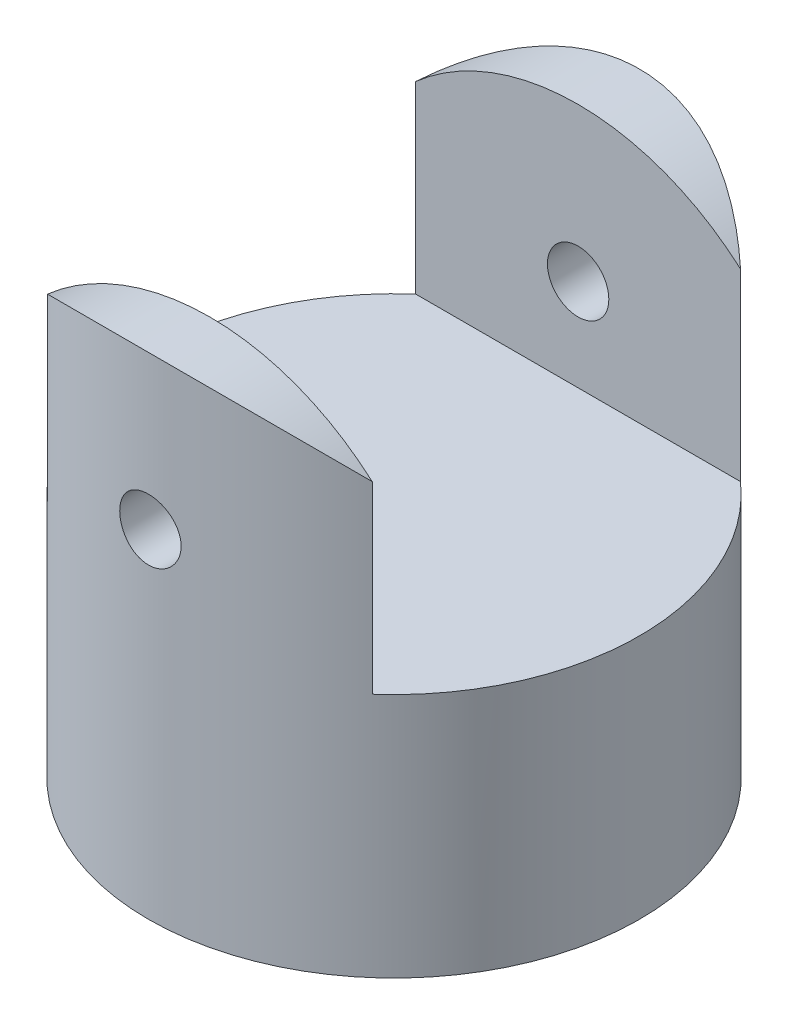
ISO-10303-21;
HEADER;
FILE_DESCRIPTION(('STEP AP214'),'2;1');
FILE_NAME('part.step','',(''),(''),'','','');
FILE_SCHEMA(('AUTOMOTIVE_DESIGN { 1 0 10303 214 1 1 1 1 }'));
ENDSEC;
DATA;
#1=APPLICATION_CONTEXT('core data for automotive mechanical design processes');
#2=APPLICATION_PROTOCOL_DEFINITION('international standard','automotive_design',2000,#1);
#3=PRODUCT_CONTEXT('',#1,'mechanical');
#4=PRODUCT('Part','Part','',(#3));
#5=PRODUCT_RELATED_PRODUCT_CATEGORY('part','',(#4));
#6=PRODUCT_DEFINITION_FORMATION('','',#4);
#7=PRODUCT_DEFINITION_CONTEXT('part definition',#1,'design');
#8=PRODUCT_DEFINITION('design','',#6,#7);
#9=PRODUCT_DEFINITION_SHAPE('','',#8);
#10=(LENGTH_UNIT() NAMED_UNIT(*) SI_UNIT(.MILLI.,.METRE.));
#11=(NAMED_UNIT(*) PLANE_ANGLE_UNIT() SI_UNIT($,.RADIAN.));
#12=(NAMED_UNIT(*) SI_UNIT($,.STERADIAN.) SOLID_ANGLE_UNIT());
#13=UNCERTAINTY_MEASURE_WITH_UNIT(LENGTH_MEASURE(1.E-05),#10,'distance_accuracy_value','');
#14=(GEOMETRIC_REPRESENTATION_CONTEXT(3) GLOBAL_UNCERTAINTY_ASSIGNED_CONTEXT((#13)) GLOBAL_UNIT_ASSIGNED_CONTEXT((#10,
#11,#12)) REPRESENTATION_CONTEXT('',''));
#15=CARTESIAN_POINT('',(0.,0.,0.));
#16=DIRECTION('',(0.,0.,1.));
#17=DIRECTION('',(1.,0.,0.));
#18=AXIS2_PLACEMENT_3D('',#15,#16,#17);
#19=CARTESIAN_POINT('',(0.,101.6,0.));
#20=DIRECTION('',(0.,-1.,0.));
#21=DIRECTION('',(0.,0.,-1.));
#22=AXIS2_PLACEMENT_3D('',#19,#20,#21);
#23=CYLINDRICAL_SURFACE('',#22,50.8);
#24=CARTESIAN_POINT('',(0.,0.,0.));
#25=DIRECTION('',(0.,1.,0.));
#26=DIRECTION('',(0.,0.,1.));
#27=AXIS2_PLACEMENT_3D('',#24,#25,#26);
#28=CIRCLE('',#27,50.8);
#29=CARTESIAN_POINT('',(0.,0.,50.8));
#30=VERTEX_POINT('',#29);
#31=EDGE_CURVE('E11',#30,#30,#28,.T.);
#32=ORIENTED_EDGE('',*,*,#31,.T.);
#33=EDGE_LOOP('',(#32));
#34=FACE_BOUND('',#33,.T.);
#35=CARTESIAN_POINT('',(-6.35,69.85,50.4015624757805));
#36=CARTESIAN_POINT('',(-6.35000203989487,69.6723456462251,50.4015617724459));
#37=CARTESIAN_POINT('',(-6.34254196397741,69.4947212229358,50.4025036623052));
#38=CARTESIAN_POINT('',(-6.312759005209,69.1406861903938,50.4062427706675));
#39=CARTESIAN_POINT('',(-6.2904327526822,68.9642758654991,50.4090404098076));
#40=CARTESIAN_POINT('',(-6.23105610404001,68.6138577778681,50.4164142968493));
#41=CARTESIAN_POINT('',(-6.19399473475625,68.4398519058691,50.4209918702032));
#42=CARTESIAN_POINT('',(-6.1054073504354,68.0955456941417,50.4317954405593));
#43=CARTESIAN_POINT('',(-6.0538760360111,67.9252467366796,50.4380220414439));
#44=CARTESIAN_POINT('',(-5.93679478043794,67.5898024386503,50.4519368909625));
#45=CARTESIAN_POINT('',(-5.87125966321623,67.4246518583972,50.459623593037));
#46=CARTESIAN_POINT('',(-5.72658692331945,67.1004129188703,50.476246911738));
#47=CARTESIAN_POINT('',(-5.64744429048729,66.9413268189319,50.4851839885139));
#48=CARTESIAN_POINT('',(-5.47618683973231,66.6304735687865,50.5040472715718));
#49=CARTESIAN_POINT('',(-5.38407914426474,66.4787024610782,50.5139729338972));
#50=CARTESIAN_POINT('',(-5.18747334832283,66.1833803824773,50.5345415425524));
#51=CARTESIAN_POINT('',(-5.08297066056124,66.0398324842584,50.5451847538085));
#52=CARTESIAN_POINT('',(-4.86182163134579,65.7613633692671,50.5669367079269));
#53=CARTESIAN_POINT('',(-4.74512128478427,65.6264851892515,50.5780473787065));
#54=CARTESIAN_POINT('',(-4.50075244796663,65.3669759506442,50.6003782807131));
#55=CARTESIAN_POINT('',(-4.37307991717111,65.2423487003382,50.6115985509405));
#56=CARTESIAN_POINT('',(-4.10773593461924,65.0043046704833,50.6338248645858));
#57=CARTESIAN_POINT('',(-3.9700676743856,64.8908843397614,50.6448309749717));
#58=CARTESIAN_POINT('',(-3.68560182620991,64.6759658783424,50.6663269717178));
#59=CARTESIAN_POINT('',(-3.53880088946156,64.5744721608238,50.6768166661608));
#60=CARTESIAN_POINT('',(-3.23669240976383,64.3838943127663,50.6970097916979));
#61=CARTESIAN_POINT('',(-3.08136107213644,64.2948476358363,50.7067108145009));
#62=CARTESIAN_POINT('',(-2.76362847887715,64.1301314259512,50.7250203999308));
#63=CARTESIAN_POINT('',(-2.60122462103643,64.054466869428,50.733628555817));
#64=CARTESIAN_POINT('',(-2.27060093472529,63.9171352956688,50.7494996764775));
#65=CARTESIAN_POINT('',(-2.10238345285501,63.855462705055,50.7567631766516));
#66=CARTESIAN_POINT('',(-1.76127307747079,63.7465143879769,50.7697464565004));
#67=CARTESIAN_POINT('',(-1.58837849199115,63.6992439494919,50.775465669078));
#68=CARTESIAN_POINT('',(-1.06648254604948,63.5800978162433,50.7899854739272));
#69=CARTESIAN_POINT('',(-0.712152784057892,63.5300112649185,50.7962529054114));
#70=CARTESIAN_POINT('',(-0.000258951354538872,63.4899859943512,50.8012493744255));
#71=CARTESIAN_POINT('',(0.35730499156902,63.5000449089312,50.7999787085111));
#72=CARTESIAN_POINT('',(1.06364943768765,63.5796978326806,50.7900842551886));
#73=CARTESIAN_POINT('',(1.41246781839155,63.6489593331639,50.7815015364853));
#74=CARTESIAN_POINT('',(2.09347734064291,63.8445526975943,50.7579900348295));
#75=CARTESIAN_POINT('',(2.42566816596078,63.9708856464915,50.7430611312341));
#76=CARTESIAN_POINT('',(3.06503935705295,64.277383838975,50.7084648907813));
#77=CARTESIAN_POINT('',(3.37215002154397,64.4576930157177,50.6887849121967));
#78=CARTESIAN_POINT('',(3.95187820604212,64.8669221469414,50.6468880296804));
#79=CARTESIAN_POINT('',(4.22449414319611,65.0958443308285,50.6246710094209));
#80=CARTESIAN_POINT('',(4.72944952315005,65.5976636444326,50.5800072309235));
#81=CARTESIAN_POINT('',(4.96150095349706,65.8708506359997,50.5575599403219));
#82=CARTESIAN_POINT('',(5.3765014606806,66.4524491474762,50.5151154284089));
#83=CARTESIAN_POINT('',(5.55945038360289,66.7608607777947,50.4951182147774));
#84=CARTESIAN_POINT('',(5.87106921154013,67.404410520541,50.459838186064));
#85=CARTESIAN_POINT('',(5.99971604051557,67.7395599235765,50.4445573759894));
#86=CARTESIAN_POINT('',(6.19882340368361,68.4269382114628,50.4204793594744));
#87=CARTESIAN_POINT('',(6.26928674205009,68.7791662723352,50.4116818405716));
#88=CARTESIAN_POINT('',(6.34964549706867,69.4881596824472,50.4016235751056));
#89=CARTESIAN_POINT('',(6.3599462400753,69.8448784028258,50.4003123930753));
#90=CARTESIAN_POINT('',(6.32075685980599,70.5549565011699,50.4052418644001));
#91=CARTESIAN_POINT('',(6.27126801094126,70.9083159505762,50.4114823567917));
#92=CARTESIAN_POINT('',(6.11424555148507,71.6004302400392,50.4307660036578));
#93=CARTESIAN_POINT('',(6.00690820952267,71.9392303046065,50.4437861510629));
#94=CARTESIAN_POINT('',(5.73743762574656,72.594023351304,50.4751433966399));
#95=CARTESIAN_POINT('',(5.57530245872045,72.9100155316513,50.4934806816156));
#96=CARTESIAN_POINT('',(5.19984241435956,73.5120568028653,50.5335268586941));
#97=CARTESIAN_POINT('',(4.98625173586604,73.7979389582555,50.5552530442091));
#98=CARTESIAN_POINT('',(4.51431819346559,74.329941618637,50.5995746759084));
#99=CARTESIAN_POINT('',(4.25597358882391,74.5760605762913,50.622170155878));
#100=CARTESIAN_POINT('',(3.70009980667142,75.0229747422861,50.6658394852623));
#101=CARTESIAN_POINT('',(3.40235567399964,75.2235036132175,50.6869039274171));
#102=CARTESIAN_POINT('',(2.77716225353209,75.5717006744396,50.7249965489663));
#103=CARTESIAN_POINT('',(2.44971356465095,75.7193699302093,50.7420248097147));
#104=CARTESIAN_POINT('',(1.77535807979755,75.9572226616698,50.7700866368921));
#105=CARTESIAN_POINT('',(1.42850612505324,76.0475600514126,50.781136241843));
#106=CARTESIAN_POINT('',(0.724214041940792,76.1686612593929,50.7960550755112));
#107=CARTESIAN_POINT('',(0.366774391773292,76.1994277640379,50.7999246280196));
#108=CARTESIAN_POINT('',(-0.167870005496841,76.2002734717288,50.8000360941758));
#109=CARTESIAN_POINT('',(-0.345320501474826,76.1930903631981,50.799135198553));
#110=CARTESIAN_POINT('',(-0.6989615660757,76.1639027633721,50.7954979030251));
#111=CARTESIAN_POINT('',(-0.875152579307878,76.1419037928384,50.7927621868217));
#112=CARTESIAN_POINT('',(-1.22508958457799,76.083230253157,50.785527732268));
#113=CARTESIAN_POINT('',(-1.39883466518892,76.046550355861,50.7810283538441));
#114=CARTESIAN_POINT('',(-1.74253780988575,75.9588053472882,50.7703959541496));
#115=CARTESIAN_POINT('',(-1.91249722771291,75.9077454703483,50.7642635273555));
#116=CARTESIAN_POINT('',(-2.24749546403996,75.791607045708,50.7505356932735));
#117=CARTESIAN_POINT('',(-2.41253425424806,75.7265284174227,50.7429402775758));
#118=CARTESIAN_POINT('',(-2.7364800012656,75.58284935233,50.72650168501));
#119=CARTESIAN_POINT('',(-2.89538915901524,75.5042538253636,50.7176589614196));
#120=CARTESIAN_POINT('',(-3.2060943494731,75.3340539006809,50.6989663968288));
#121=CARTESIAN_POINT('',(-3.3578877530895,75.2424447443619,50.6891161877988));
#122=CARTESIAN_POINT('',(-3.65319907286078,75.0469207476191,50.6686889458946));
#123=CARTESIAN_POINT('',(-3.79671993916994,74.9430103349514,50.6581121751132));
#124=CARTESIAN_POINT('',(-4.07552183803727,74.7228218378246,50.6364474536515));
#125=CARTESIAN_POINT('',(-4.21073899827056,74.6064631663728,50.625356472804));
#126=CARTESIAN_POINT('',(-4.47085530016084,74.3628367231213,50.6030482387092));
#127=CARTESIAN_POINT('',(-4.59575816460574,74.2355729214562,50.5918310326968));
#128=CARTESIAN_POINT('',(-4.83450252279129,73.970905984589,50.5695755578911));
#129=CARTESIAN_POINT('',(-4.94833728132752,73.8334967640251,50.5585374014152));
#130=CARTESIAN_POINT('',(-5.16402028657672,73.5496161742959,50.5369631137883));
#131=CARTESIAN_POINT('',(-5.26587294405924,73.4031481702725,50.526426798758));
#132=CARTESIAN_POINT('',(-5.45732534322165,73.1014840061042,50.5061076577078));
#133=CARTESIAN_POINT('',(-5.54687124892006,72.9462534417305,50.4963282192758));
#134=CARTESIAN_POINT('',(-5.71251918892864,72.6287892790805,50.4778572291337));
#135=CARTESIAN_POINT('',(-5.78862615550866,72.4665582773742,50.4691652786438));
#136=CARTESIAN_POINT('',(-5.92682699737534,72.1363140898845,50.453122435298));
#137=CARTESIAN_POINT('',(-5.98893181612342,71.9683055387777,50.4457704960155));
#138=CARTESIAN_POINT('',(-6.09873035923158,71.627644041349,50.4326138246151));
#139=CARTESIAN_POINT('',(-6.14642748503742,71.4549922017381,50.4268087273485));
#140=CARTESIAN_POINT('',(-6.24091158607037,71.0463613520906,50.4152165069054));
#141=CARTESIAN_POINT('',(-6.28177759879871,70.8089689520907,50.4101181870146));
#142=CARTESIAN_POINT('',(-6.33632032192491,70.3310327364692,50.4032916602856));
#143=CARTESIAN_POINT('',(-6.34999723861445,70.090488944772,50.4015634278775));
#144=CARTESIAN_POINT('',(-6.35,69.85,50.4015624757805));
#145=B_SPLINE_CURVE_WITH_KNOTS('',3,(#35,#36,#37,#38,#39,#40,#41,#42,#43,#44,#45,#46,#47,#48,
#49,#50,#51,#52,#53,#54,#55,#56,#57,#58,#59,#60,#61,#62,#63,#64,#65,#66,#67,#68,#69,#70,#71,#72,
#73,#74,#75,#76,#77,#78,#79,#80,#81,#82,#83,#84,#85,#86,#87,#88,#89,#90,#91,#92,#93,#94,#95,#96,
#97,#98,#99,#100,#101,#102,#103,#104,#105,#106,#107,#108,#109,#110,#111,#112,#113,#114,#115,
#116,#117,#118,#119,#120,#121,#122,#123,#124,#125,#126,#127,#128,#129,#130,#131,#132,#133,#134,
#135,#136,#137,#138,#139,#140,#141,#142,#143,#144),.UNSPECIFIED.,.T.,.F.,(4,2,2,2,2,2,2,2,2,2,2,
2,2,2,2,2,2,2,2,2,2,2,2,2,2,2,2,2,2,2,2,2,2,2,2,2,2,2,2,2,2,2,2,2,2,2,2,2,2,2,2,2,2,2,4),(0.,
0.53275257484905,1.06562594840265,1.59889689562766,2.13236340015061,2.66526796903414,
3.19836917010625,3.731178642768,4.26418592286184,4.79966199028999,5.33533610033267,
5.87083992153722,6.40654127421599,6.94382138418359,7.48130087522639,8.01856589631348,
8.55602794573375,9.62416161341509,10.6922532600228,11.7543851404013,12.8165372131655,
13.8815472431873,14.9466061254173,16.0189443644974,17.0912859648355,18.1640828062729,
19.2368279408693,20.3023373833715,21.3678241150108,22.4297184089375,23.4916500142831,
24.5591894675225,25.6267704527703,26.7004365527676,27.7740810099076,28.8448308134396,
29.9155323293315,30.4478085713933,30.9798865836407,31.5121578783016,32.0442356751776,
32.5763165307169,33.1082045213089,33.6402875067102,34.1721795513591,34.7077512475114,
35.2431287845357,35.778830098798,36.3143335931566,36.8521097677744,37.3896881592713,
37.9268449354128,38.463874797396,39.1850621701297,39.9062440709818),.UNSPECIFIED.);
#146=CARTESIAN_POINT('',(-6.35,69.85,50.4015624757805));
#147=VERTEX_POINT('',#146);
#148=EDGE_CURVE('E86',#147,#147,#145,.T.);
#149=ORIENTED_EDGE('',*,*,#148,.F.);
#150=EDGE_LOOP('',(#149));
#151=FACE_BOUND('',#150,.T.);
#152=CARTESIAN_POINT('',(0.,76.2,-50.8));
#153=CARTESIAN_POINT('',(0.177660452279513,76.2000020389134,-50.800000683468));
#154=CARTESIAN_POINT('',(0.355290973510379,76.1925414557762,-50.7990661797892));
#155=CARTESIAN_POINT('',(0.709338366021003,76.1627564216225,-50.7953557357901));
#156=CARTESIAN_POINT('',(0.885754953053624,76.1404286015373,-50.7925793780872));
#157=CARTESIAN_POINT('',(1.23618570300819,76.0810476643267,-50.7852595825665));
#158=CARTESIAN_POINT('',(1.4101979769568,76.0439835823476,-50.780714828987));
#159=CARTESIAN_POINT('',(1.75451712697435,75.9553895038783,-50.7699847171764));
#160=CARTESIAN_POINT('',(1.92482262115234,75.9038542087673,-50.7637987580653));
#161=CARTESIAN_POINT('',(2.26028082300217,75.7867633397459,-50.7499683338145));
#162=CARTESIAN_POINT('',(2.42543874168481,75.721222509614,-50.7423254033505));
#163=CARTESIAN_POINT('',(2.74969172401868,75.5765369579401,-50.7257879361098));
#164=CARTESIAN_POINT('',(2.90878452822901,75.4973872260137,-50.7168929385795));
#165=CARTESIAN_POINT('',(3.21964998300994,75.3261144911001,-50.6981073841005));
#166=CARTESIAN_POINT('',(3.3714265955735,75.2339986181729,-50.6882173751539));
#167=CARTESIAN_POINT('',(3.66675816285127,75.0373757158854,-50.667709710111));
#168=CARTESIAN_POINT('',(3.81031004442853,74.9328640991113,-50.6570917852451));
#169=CARTESIAN_POINT('',(4.08877364468726,74.7117061541343,-50.6353782078992));
#170=CARTESIAN_POINT('',(4.22364310242766,74.5950068032763,-50.6242806024837));
#171=CARTESIAN_POINT('',(4.48313482314154,74.3506418034631,-50.601961144221));
#172=CARTESIAN_POINT('',(4.60775327790533,74.2229721147581,-50.5907392469407));
#173=CARTESIAN_POINT('',(4.84578010749614,73.9576355600757,-50.5684951642058));
#174=CARTESIAN_POINT('',(4.95919202103944,73.8199718738995,-50.5574729166111));
#175=CARTESIAN_POINT('',(5.17409430632028,73.5355168898857,-50.5359319534138));
#176=CARTESIAN_POINT('',(5.27558026453383,73.3887222434309,-50.5254134250741));
#177=CARTESIAN_POINT('',(5.46614935167707,73.086618716755,-50.5051524694461));
#178=CARTESIAN_POINT('',(5.5551942696914,72.9312855627497,-50.4954124708714));
#179=CARTESIAN_POINT('',(5.71990676958976,72.6135494702167,-50.4770198884538));
#180=CARTESIAN_POINT('',(5.79556937487341,72.4511439294795,-50.4683677094925));
#181=CARTESIAN_POINT('',(5.93289692109492,72.1205168103423,-50.4524085385076));
#182=CARTESIAN_POINT('',(5.99456744482886,71.952297582566,-50.4451010101935));
#183=CARTESIAN_POINT('',(6.10351153700927,71.6111833596758,-50.4320345801865));
#184=CARTESIAN_POINT('',(6.15077981821715,71.4382866727098,-50.4262762473127));
#185=CARTESIAN_POINT('',(6.26991974827309,70.9163812495022,-50.4116539346605));
#186=CARTESIAN_POINT('',(6.32000152949766,70.5620432676022,-50.4053374088251));
#187=CARTESIAN_POINT('',(6.36001442106728,69.8501333107816,-50.4003032854169));
#188=CARTESIAN_POINT('',(6.34994795030807,69.4925614664901,-50.4015853822612));
#189=CARTESIAN_POINT('',(6.2702829644624,68.7862500820239,-50.411557471348));
#190=CARTESIAN_POINT('',(6.20102456737442,68.4374717787044,-50.4202051399019));
#191=CARTESIAN_POINT('',(6.00545126391526,67.7565408023729,-50.4438714581299));
#192=CARTESIAN_POINT('',(5.87913520152311,67.424388466364,-50.4588902368859));
#193=CARTESIAN_POINT('',(5.57267217494511,66.785064316598,-50.4936536009976));
#194=CARTESIAN_POINT('',(5.39237737135388,66.4779640945263,-50.5134111351251));
#195=CARTESIAN_POINT('',(4.98317902548835,65.8982507190189,-50.555416054782));
#196=CARTESIAN_POINT('',(4.75427325986254,65.6256391439234,-50.5776635541746));
#197=CARTESIAN_POINT('',(4.25246571612427,65.1206655897828,-50.6223297954269));
#198=CARTESIAN_POINT('',(3.97927069316312,64.8885949270085,-50.6447486577549));
#199=CARTESIAN_POINT('',(3.39764921629989,64.4735594246282,-50.6870876657907));
#200=CARTESIAN_POINT('',(3.08922268116004,64.2905946982552,-50.7070078057368));
#201=CARTESIAN_POINT('',(2.44566864345097,63.9789644513813,-50.7421172666534));
#202=CARTESIAN_POINT('',(2.11053221566251,63.8503171724763,-50.7573049978767));
#203=CARTESIAN_POINT('',(1.42318216919017,63.6512049451163,-50.7812239587359));
#204=CARTESIAN_POINT('',(1.07096935081085,63.5807372727929,-50.7899554906379));
#205=CARTESIAN_POINT('',(0.361983436172469,63.5003621423574,-50.7999389488425));
#206=CARTESIAN_POINT('',(0.0052565049241095,63.4900533779954,-50.8012404379828));
#207=CARTESIAN_POINT('',(-0.704839932523279,63.529229645902,-50.796350985378));
#208=CARTESIAN_POINT('',(-1.05820951006075,63.5787134047976,-50.7901602031923));
#209=CARTESIAN_POINT('',(-1.75037625016444,63.7357366547267,-50.7710127262508));
#210=CARTESIAN_POINT('',(-2.08921749090307,63.8430847982291,-50.7580783360367));
#211=CARTESIAN_POINT('',(-2.74408812131596,64.1125907486731,-50.7268917673806));
#212=CARTESIAN_POINT('',(-3.06011673597601,64.2747504166664,-50.7086394083772));
#213=CARTESIAN_POINT('',(-3.66218349013086,64.6502468911702,-50.6687282995312));
#214=CARTESIAN_POINT('',(-3.94805857862939,64.8638432839353,-50.6470524697548));
#215=CARTESIAN_POINT('',(-4.48004432527763,65.3357840159195,-50.6027726239969));
#216=CARTESIAN_POINT('',(-4.7261534042659,65.5941301313663,-50.580168571199));
#217=CARTESIAN_POINT('',(-5.1730452819104,66.1499997417054,-50.5364268452441));
#218=CARTESIAN_POINT('',(-5.37356206840866,66.4477378952279,-50.5152982525453));
#219=CARTESIAN_POINT('',(-5.72173794062838,67.0729160462492,-50.4770495657174));
#220=CARTESIAN_POINT('',(-5.86939808596192,67.4003554481651,-50.4599293912343));
#221=CARTESIAN_POINT('',(-6.10724499412083,68.0747160305878,-50.4316957332253));
#222=CARTESIAN_POINT('',(-6.19758172467742,68.4215837711986,-50.420566587835));
#223=CARTESIAN_POINT('',(-6.31867625374529,69.1259092632763,-50.405537603827));
#224=CARTESIAN_POINT('',(-6.34943682390105,69.4833665213044,-50.4016374288984));
#225=CARTESIAN_POINT('',(-6.35026929057823,70.0180145234019,-50.401526560281));
#226=CARTESIAN_POINT('',(-6.34308284910089,70.1954517164508,-50.402435095144));
#227=CARTESIAN_POINT('',(-6.31389085000219,70.5490657907668,-50.4061013328048));
#228=CARTESIAN_POINT('',(-6.29189081269728,70.7252431168185,-50.4088583467615));
#229=CARTESIAN_POINT('',(-6.23321749451058,71.0751525387371,-50.4161467962799));
#230=CARTESIAN_POINT('',(-6.1965388770065,71.2488837214648,-50.4206788771817));
#231=CARTESIAN_POINT('',(-6.1087988856385,71.5925590291513,-50.4313843766276));
#232=CARTESIAN_POINT('',(-6.05774274337944,71.7625045074011,-50.4375571981034));
#233=CARTESIAN_POINT('',(-5.9416147618522,72.097473793219,-50.4513689507146));
#234=CARTESIAN_POINT('',(-5.87654296130369,72.2624976143823,-50.4590078777997));
#235=CARTESIAN_POINT('',(-5.73288012300273,72.5864144701147,-50.475531778632));
#236=CARTESIAN_POINT('',(-5.65429399287328,72.7453097046772,-50.4844162998358));
#237=CARTESIAN_POINT('',(-5.48411509023544,73.05598877202,-50.5031861238308));
#238=CARTESIAN_POINT('',(-5.39251755330393,73.2077699726382,-50.5130717928327));
#239=CARTESIAN_POINT('',(-5.19701859385404,73.5030590932998,-50.5335596413456));
#240=CARTESIAN_POINT('',(-5.09312159732418,73.6465699619675,-50.5441615625256));
#241=CARTESIAN_POINT('',(-4.87294741221252,73.9253719869254,-50.5658649879454));
#242=CARTESIAN_POINT('',(-4.7565881660522,74.0605981166,-50.5769694854165));
#243=CARTESIAN_POINT('',(-4.51295871675041,74.3207324606479,-50.5992900846759));
#244=CARTESIAN_POINT('',(-4.38569248450023,74.4456443978484,-50.6105061445442));
#245=CARTESIAN_POINT('',(-4.12101889507186,74.6844065837674,-50.6327447984795));
#246=CARTESIAN_POINT('',(-3.98360546081123,74.7982501075966,-50.6437672716371));
#247=CARTESIAN_POINT('',(-3.69971470441231,75.0139500112115,-50.6652974325924));
#248=CARTESIAN_POINT('',(-3.55324074911996,75.1158108033771,-50.675805309042));
#249=CARTESIAN_POINT('',(-3.25157211236694,75.3072728234851,-50.6960572676805));
#250=CARTESIAN_POINT('',(-3.09634349922942,75.3968209597114,-50.7057979692604));
#251=CARTESIAN_POINT('',(-2.77888304693642,75.5624735579082,-50.7241863205772));
#252=CARTESIAN_POINT('',(-2.61665380433061,75.6385829519053,-50.7328343709849));
#253=CARTESIAN_POINT('',(-2.2864131115837,75.7767887812172,-50.7487892612146));
#254=CARTESIAN_POINT('',(-2.11840629094841,75.8388961479468,-50.7560971464692));
#255=CARTESIAN_POINT('',(-1.77774856333515,75.948699863992,-50.7691705327862));
#256=CARTESIAN_POINT('',(-1.60509876229306,75.9963996125968,-50.7749363976313));
#257=CARTESIAN_POINT('',(-1.19645220164781,76.090894916944,-50.7864482399361));
#258=CARTESIAN_POINT('',(-0.959041640152756,76.1317672077368,-50.7915088942137));
#259=CARTESIAN_POINT('',(-0.481069086110401,76.1863182689163,-50.7982842992882));
#260=CARTESIAN_POINT('',(-0.24050711681505,76.1999972398292,-50.799999074758));
#261=CARTESIAN_POINT('',(0.,76.2,-50.8));
#262=B_SPLINE_CURVE_WITH_KNOTS('',3,(#152,#153,#154,#155,#156,#157,#158,#159,#160,#161,#162,
#163,#164,#165,#166,#167,#168,#169,#170,#171,#172,#173,#174,#175,#176,#177,#178,#179,#180,#181,
#182,#183,#184,#185,#186,#187,#188,#189,#190,#191,#192,#193,#194,#195,#196,#197,#198,#199,#200,
#201,#202,#203,#204,#205,#206,#207,#208,#209,#210,#211,#212,#213,#214,#215,#216,#217,#218,#219,
#220,#221,#222,#223,#224,#225,#226,#227,#228,#229,#230,#231,#232,#233,#234,#235,#236,#237,#238,
#239,#240,#241,#242,#243,#244,#245,#246,#247,#248,#249,#250,#251,#252,#253,#254,#255,#256,#257,
#258,#259,#260,#261),.UNSPECIFIED.,.T.,.F.,(4,2,2,2,2,2,2,2,2,2,2,2,2,2,2,2,2,2,2,2,2,2,2,2,2,2,
2,2,2,2,2,2,2,2,2,2,2,2,2,2,2,2,2,2,2,2,2,2,2,2,2,2,2,2,4),(0.,0.532770890036462,
1.06566255254233,1.59895146960223,2.13243590507214,2.66536147825353,3.1984836802343,
3.73131385621669,4.26434184077447,4.79979383345942,5.33544385457953,5.8709241880319,
6.40660207058526,6.94389065283161,7.48137862319398,8.01865175893931,8.55612189720504,
9.62427916625867,10.6923934790566,11.7544113336051,12.8164507062087,13.8814258716387,
14.9464497570326,16.0188371886511,17.0912270930592,18.1639768555689,19.2366763909421,
20.3022119405409,21.3677247983351,22.4297356128784,23.4917824901914,24.5593058783681,
25.6268716489134,26.7005149202785,27.7741366672132,28.8449379307217,29.915689376456,
30.4479262694048,30.9799649328867,31.512197203143,32.0442360577022,32.5762734424696,
33.1081180284452,33.640157865869,34.1720068262235,34.7076024551421,35.2430039121809,
35.7787286590514,36.3142555153479,36.8520236098181,37.3895939309911,37.9267431051648,
38.4637654468358,39.1850071972271,39.9062436290925),.UNSPECIFIED.);
#263=CARTESIAN_POINT('',(0.,76.2,-50.8));
#264=VERTEX_POINT('',#263);
#265=EDGE_CURVE('E110',#264,#264,#262,.T.);
#266=ORIENTED_EDGE('',*,*,#265,.F.);
#267=EDGE_LOOP('',(#266));
#268=FACE_BOUND('',#267,.T.);
#269=DIRECTION('',(0.,-1.,0.));
#270=VECTOR('',#269,1.);
#271=CARTESIAN_POINT('',(-33.6010416505203,101.6,38.1));
#272=LINE('',#271,#270);
#273=CARTESIAN_POINT('',(-33.6010416505203,50.8,38.1));
#274=VERTEX_POINT('',#273);
#275=CARTESIAN_POINT('',(-33.6010416505203,88.9,38.1));
#276=VERTEX_POINT('',#275);
#277=EDGE_CURVE('E58',#274,#276,#272,.F.);
#278=ORIENTED_EDGE('',*,*,#277,.F.);
#279=CARTESIAN_POINT('',(0.,50.8,0.));
#280=DIRECTION('',(0.,1.,0.));
#281=DIRECTION('',(0.,0.,1.));
#282=AXIS2_PLACEMENT_3D('',#279,#280,#281);
#283=CIRCLE('',#282,50.8);
#284=CARTESIAN_POINT('',(-33.6010416505202,50.8,-38.1));
#285=VERTEX_POINT('',#284);
#286=EDGE_CURVE('E87',#285,#274,#283,.T.);
#287=ORIENTED_EDGE('',*,*,#286,.F.);
#288=DIRECTION('',(0.,-1.,0.));
#289=VECTOR('',#288,1.);
#290=CARTESIAN_POINT('',(-33.6010416505203,101.6,-38.1));
#291=LINE('',#290,#289);
#292=CARTESIAN_POINT('',(-33.6010416505203,88.9,-38.1));
#293=VERTEX_POINT('',#292);
#294=EDGE_CURVE('E91',#293,#285,#291,.T.);
#295=ORIENTED_EDGE('',*,*,#294,.F.);
#296=CARTESIAN_POINT('',(0.,50.8,0.));
#297=DIRECTION('',(0.,-0.707106781186547,-0.707106781186547));
#298=DIRECTION('',(0.,-0.707106781186547,0.707106781186547));
#299=AXIS2_PLACEMENT_3D('',#296,#297,#298);
#300=ELLIPSE('',#299,71.8420489685532,50.8);
#301=CARTESIAN_POINT('',(33.6010416505203,88.9,-38.1));
#302=VERTEX_POINT('',#301);
#303=EDGE_CURVE('E95',#302,#293,#300,.F.);
#304=ORIENTED_EDGE('',*,*,#303,.F.);
#305=DIRECTION('',(0.,-1.,0.));
#306=VECTOR('',#305,1.);
#307=CARTESIAN_POINT('',(33.6010416505203,101.6,-38.1));
#308=LINE('',#307,#306);
#309=CARTESIAN_POINT('',(33.6010416505203,50.8,-38.1));
#310=VERTEX_POINT('',#309);
#311=EDGE_CURVE('E50',#310,#302,#308,.F.);
#312=ORIENTED_EDGE('',*,*,#311,.F.);
#313=CARTESIAN_POINT('',(33.6010416505203,50.8,38.1));
#314=VERTEX_POINT('',#313);
#315=EDGE_CURVE('E79',#314,#310,#283,.T.);
#316=ORIENTED_EDGE('',*,*,#315,.F.);
#317=DIRECTION('',(0.,-1.,0.));
#318=VECTOR('',#317,1.);
#319=CARTESIAN_POINT('',(33.6010416505203,101.6,38.1));
#320=LINE('',#319,#318);
#321=CARTESIAN_POINT('',(33.6010416505203,88.9,38.1));
#322=VERTEX_POINT('',#321);
#323=EDGE_CURVE('E106',#322,#314,#320,.T.);
#324=ORIENTED_EDGE('',*,*,#323,.F.);
#325=CARTESIAN_POINT('',(0.,50.8,0.));
#326=DIRECTION('',(0.,-0.707106781186547,0.707106781186547));
#327=DIRECTION('',(0.,-0.707106781186547,-0.707106781186547));
#328=AXIS2_PLACEMENT_3D('',#325,#326,#327);
#329=ELLIPSE('',#328,71.8420489685532,50.8);
#330=EDGE_CURVE('E42',#276,#322,#329,.F.);
#331=ORIENTED_EDGE('',*,*,#330,.F.);
#332=EDGE_LOOP('',(#278,#287,#295,#304,#312,#316,#324,#331));
#333=FACE_BOUND('',#332,.T.);
#334=ADVANCED_FACE('F33',(#34,#151,#268,#333),#23,.T.);
#335=CARTESIAN_POINT('',(0.,50.8,96.52));
#336=DIRECTION('',(0.,0.,-1.));
#337=DIRECTION('',(-1.,0.,0.));
#338=AXIS2_PLACEMENT_3D('',#335,#336,#337);
#339=CYLINDRICAL_SURFACE('',#338,50.8);
#340=ORIENTED_EDGE('',*,*,#330,.T.);
#341=CARTESIAN_POINT('',(0.,50.8,38.1));
#342=DIRECTION('',(0.,0.,-1.));
#343=DIRECTION('',(0.,1.,0.));
#344=AXIS2_PLACEMENT_3D('',#341,#342,#343);
#345=CIRCLE('',#344,50.8);
#346=EDGE_CURVE('E103',#322,#276,#345,.F.);
#347=ORIENTED_EDGE('',*,*,#346,.T.);
#348=EDGE_LOOP('',(#340,#347));
#349=FACE_BOUND('',#348,.T.);
#350=ADVANCED_FACE('F129',(#349),#339,.T.);
#351=ORIENTED_EDGE('',*,*,#303,.T.);
#352=CARTESIAN_POINT('',(0.,50.8,-38.1));
#353=DIRECTION('',(0.,0.,1.));
#354=DIRECTION('',(0.,-1.,0.));
#355=AXIS2_PLACEMENT_3D('',#352,#353,#354);
#356=CIRCLE('',#355,50.8);
#357=EDGE_CURVE('E96',#293,#302,#356,.F.);
#358=ORIENTED_EDGE('',*,*,#357,.T.);
#359=EDGE_LOOP('',(#351,#358));
#360=FACE_BOUND('',#359,.T.);
#361=ADVANCED_FACE('F125',(#360),#339,.T.);
#362=CARTESIAN_POINT('',(0.,69.85,96.52));
#363=DIRECTION('',(0.,0.,-1.));
#364=DIRECTION('',(-1.,0.,0.));
#365=AXIS2_PLACEMENT_3D('',#362,#363,#364);
#366=CYLINDRICAL_SURFACE('',#365,6.35);
#367=ORIENTED_EDGE('',*,*,#148,.T.);
#368=EDGE_LOOP('',(#367));
#369=FACE_BOUND('',#368,.T.);
#370=CARTESIAN_POINT('',(0.,69.85,38.1));
#371=DIRECTION('',(0.,0.,-1.));
#372=DIRECTION('',(0.,1.,0.));
#373=AXIS2_PLACEMENT_3D('',#370,#371,#372);
#374=CIRCLE('',#373,6.35);
#375=CARTESIAN_POINT('',(0.,76.2,38.1));
#376=VERTEX_POINT('',#375);
#377=EDGE_CURVE('E37',#376,#376,#374,.T.);
#378=ORIENTED_EDGE('',*,*,#377,.T.);
#379=EDGE_LOOP('',(#378));
#380=FACE_BOUND('',#379,.T.);
#381=ADVANCED_FACE('F119',(#369,#380),#366,.F.);
#382=ORIENTED_EDGE('',*,*,#265,.T.);
#383=EDGE_LOOP('',(#382));
#384=FACE_BOUND('',#383,.T.);
#385=CARTESIAN_POINT('',(0.,69.85,-38.1));
#386=DIRECTION('',(0.,0.,1.));
#387=DIRECTION('',(0.,-1.,0.));
#388=AXIS2_PLACEMENT_3D('',#385,#386,#387);
#389=CIRCLE('',#388,6.35);
#390=CARTESIAN_POINT('',(0.,63.5,-38.1));
#391=VERTEX_POINT('',#390);
#392=EDGE_CURVE('E99',#391,#391,#389,.T.);
#393=ORIENTED_EDGE('',*,*,#392,.T.);
#394=EDGE_LOOP('',(#393));
#395=FACE_BOUND('',#394,.T.);
#396=ADVANCED_FACE('F124',(#384,#395),#366,.F.);
#397=CARTESIAN_POINT('',(0.,0.,0.));
#398=DIRECTION('',(0.,1.,0.));
#399=DIRECTION('',(0.,0.,1.));
#400=AXIS2_PLACEMENT_3D('',#397,#398,#399);
#401=PLANE('',#400);
#402=ORIENTED_EDGE('',*,*,#31,.F.);
#403=EDGE_LOOP('',(#402));
#404=FACE_BOUND('',#403,.T.);
#405=ADVANCED_FACE('F133',(#404),#401,.F.);
#406=CARTESIAN_POINT('',(103.886,50.8,38.1));
#407=DIRECTION('',(0.,1.,0.));
#408=DIRECTION('',(0.,0.,1.));
#409=AXIS2_PLACEMENT_3D('',#406,#407,#408);
#410=PLANE('',#409);
#411=ORIENTED_EDGE('',*,*,#315,.T.);
#412=DIRECTION('',(-1.,0.,0.));
#413=VECTOR('',#412,1.);
#414=CARTESIAN_POINT('',(103.886,50.8,-38.1));
#415=LINE('',#414,#413);
#416=EDGE_CURVE('E81',#310,#285,#415,.T.);
#417=ORIENTED_EDGE('',*,*,#416,.T.);
#418=ORIENTED_EDGE('',*,*,#286,.T.);
#419=DIRECTION('',(-1.,0.,0.));
#420=VECTOR('',#419,1.);
#421=CARTESIAN_POINT('',(103.886,50.8,38.1));
#422=LINE('',#421,#420);
#423=EDGE_CURVE('E83',#314,#274,#422,.T.);
#424=ORIENTED_EDGE('',*,*,#423,.F.);
#425=EDGE_LOOP('',(#411,#417,#418,#424));
#426=FACE_BOUND('',#425,.T.);
#427=ADVANCED_FACE('F80',(#426),#410,.T.);
#428=CARTESIAN_POINT('',(103.886,133.276489684438,38.1));
#429=DIRECTION('',(0.,0.,-1.));
#430=DIRECTION('',(0.,1.,0.));
#431=AXIS2_PLACEMENT_3D('',#428,#429,#430);
#432=PLANE('',#431);
#433=ORIENTED_EDGE('',*,*,#377,.F.);
#434=EDGE_LOOP('',(#433));
#435=FACE_BOUND('',#434,.T.);
#436=ORIENTED_EDGE('',*,*,#323,.T.);
#437=ORIENTED_EDGE('',*,*,#423,.T.);
#438=ORIENTED_EDGE('',*,*,#277,.T.);
#439=ORIENTED_EDGE('',*,*,#346,.F.);
#440=EDGE_LOOP('',(#436,#437,#438,#439));
#441=FACE_BOUND('',#440,.T.);
#442=ADVANCED_FACE('F127',(#435,#441),#432,.T.);
#443=CARTESIAN_POINT('',(103.886,133.276489684438,-38.1));
#444=DIRECTION('',(0.,0.,1.));
#445=DIRECTION('',(0.,-1.,0.));
#446=AXIS2_PLACEMENT_3D('',#443,#444,#445);
#447=PLANE('',#446);
#448=ORIENTED_EDGE('',*,*,#392,.F.);
#449=EDGE_LOOP('',(#448));
#450=FACE_BOUND('',#449,.T.);
#451=ORIENTED_EDGE('',*,*,#294,.T.);
#452=ORIENTED_EDGE('',*,*,#416,.F.);
#453=ORIENTED_EDGE('',*,*,#311,.T.);
#454=ORIENTED_EDGE('',*,*,#357,.F.);
#455=EDGE_LOOP('',(#451,#452,#453,#454));
#456=FACE_BOUND('',#455,.T.);
#457=ADVANCED_FACE('F89',(#450,#456),#447,.T.);
#458=CLOSED_SHELL('',(#334,#350,#361,#381,#396,#405,#427,#442,#457));
#459=MANIFOLD_SOLID_BREP('B2',#458);
#460=ADVANCED_BREP_SHAPE_REPRESENTATION('',(#18,#459),#14);
#461=SHAPE_DEFINITION_REPRESENTATION(#9,#460);
ENDSEC;
END-ISO-10303-21;
